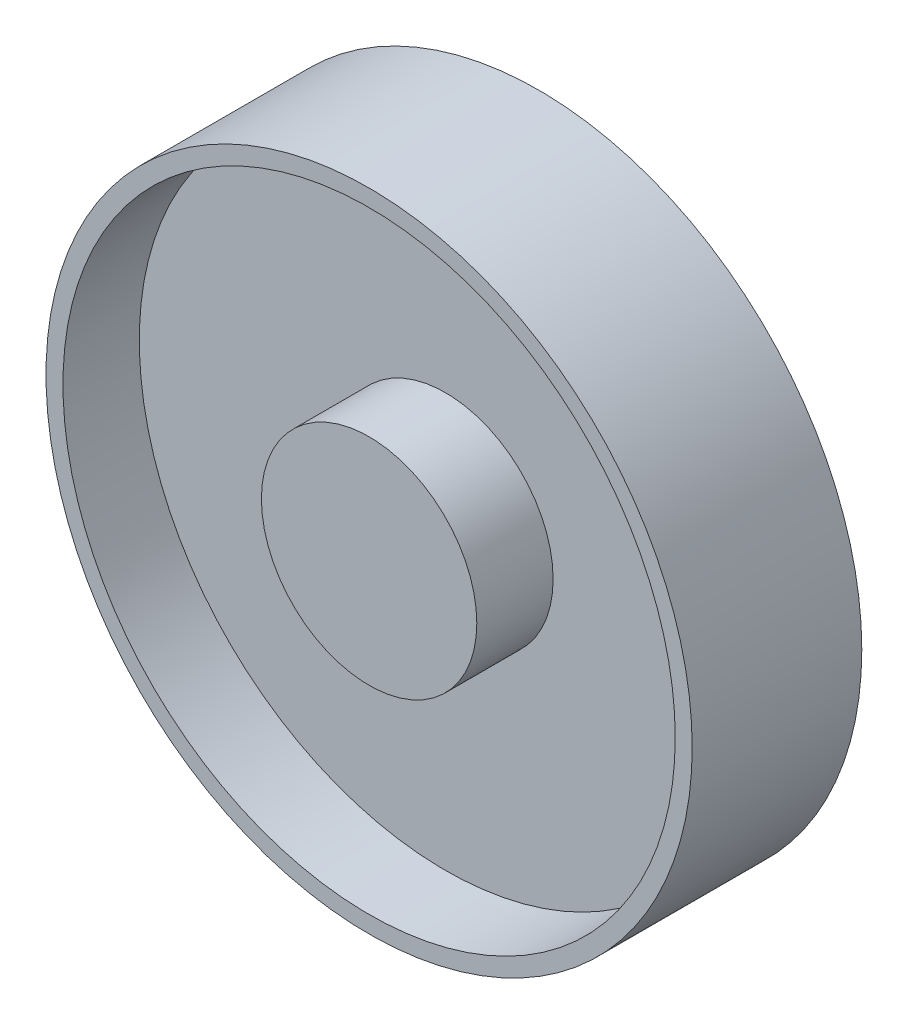
ISO-10303-21;
HEADER;
FILE_DESCRIPTION(('STEP AP214'),'2;1');
FILE_NAME('part.step','',(''),(''),'','','');
FILE_SCHEMA(('AUTOMOTIVE_DESIGN { 1 0 10303 214 1 1 1 1 }'));
ENDSEC;
DATA;
#1=APPLICATION_CONTEXT('core data for automotive mechanical design processes');
#2=APPLICATION_PROTOCOL_DEFINITION('international standard','automotive_design',2000,#1);
#3=PRODUCT_CONTEXT('',#1,'mechanical');
#4=PRODUCT('Part','Part','',(#3));
#5=PRODUCT_RELATED_PRODUCT_CATEGORY('part','',(#4));
#6=PRODUCT_DEFINITION_FORMATION('','',#4);
#7=PRODUCT_DEFINITION_CONTEXT('part definition',#1,'design');
#8=PRODUCT_DEFINITION('design','',#6,#7);
#9=PRODUCT_DEFINITION_SHAPE('','',#8);
#10=(LENGTH_UNIT() NAMED_UNIT(*) SI_UNIT(.MILLI.,.METRE.));
#11=(NAMED_UNIT(*) PLANE_ANGLE_UNIT() SI_UNIT($,.RADIAN.));
#12=(NAMED_UNIT(*) SI_UNIT($,.STERADIAN.) SOLID_ANGLE_UNIT());
#13=UNCERTAINTY_MEASURE_WITH_UNIT(LENGTH_MEASURE(1.E-05),#10,'distance_accuracy_value','');
#14=(GEOMETRIC_REPRESENTATION_CONTEXT(3) GLOBAL_UNCERTAINTY_ASSIGNED_CONTEXT((#13)) GLOBAL_UNIT_ASSIGNED_CONTEXT((#10,
#11,#12)) REPRESENTATION_CONTEXT('',''));
#15=CARTESIAN_POINT('',(0.,0.,0.));
#16=DIRECTION('',(0.,0.,1.));
#17=DIRECTION('',(1.,0.,0.));
#18=AXIS2_PLACEMENT_3D('',#15,#16,#17);
#19=CARTESIAN_POINT('',(0.,0.,0.5));
#20=DIRECTION('',(0.,0.,1.));
#21=DIRECTION('',(1.,0.,0.));
#22=AXIS2_PLACEMENT_3D('',#19,#20,#21);
#23=PLANE('',#22);
#24=CARTESIAN_POINT('',(0.,0.,0.5));
#25=DIRECTION('',(0.,0.,1.));
#26=DIRECTION('',(1.,0.,0.));
#27=AXIS2_PLACEMENT_3D('',#24,#25,#26);
#28=CIRCLE('',#27,6.35);
#29=CARTESIAN_POINT('',(6.35,0.,0.5));
#30=VERTEX_POINT('',#29);
#31=EDGE_CURVE('E11',#30,#30,#28,.T.);
#32=ORIENTED_EDGE('',*,*,#31,.F.);
#33=EDGE_LOOP('',(#32));
#34=FACE_BOUND('',#33,.T.);
#35=CARTESIAN_POINT('',(0.,0.,0.5));
#36=DIRECTION('',(0.,0.,1.));
#37=DIRECTION('',(1.,0.,0.));
#38=AXIS2_PLACEMENT_3D('',#35,#36,#37);
#39=CIRCLE('',#38,18.05);
#40=CARTESIAN_POINT('',(18.05,0.,0.5));
#41=VERTEX_POINT('',#40);
#42=EDGE_CURVE('E62',#41,#41,#39,.F.);
#43=ORIENTED_EDGE('',*,*,#42,.F.);
#44=EDGE_LOOP('',(#43));
#45=FACE_BOUND('',#44,.T.);
#46=ADVANCED_FACE('F43',(#34,#45),#23,.T.);
#47=CARTESIAN_POINT('',(0.,0.,5.));
#48=DIRECTION('',(0.,0.,-1.));
#49=DIRECTION('',(-1.,0.,0.));
#50=AXIS2_PLACEMENT_3D('',#47,#48,#49);
#51=CYLINDRICAL_SURFACE('',#50,6.35);
#52=ORIENTED_EDGE('',*,*,#31,.T.);
#53=EDGE_LOOP('',(#52));
#54=FACE_BOUND('',#53,.T.);
#55=CARTESIAN_POINT('',(0.,0.,5.));
#56=DIRECTION('',(0.,0.,1.));
#57=DIRECTION('',(1.,0.,0.));
#58=AXIS2_PLACEMENT_3D('',#55,#56,#57);
#59=CIRCLE('',#58,6.35);
#60=CARTESIAN_POINT('',(6.35,0.,5.));
#61=VERTEX_POINT('',#60);
#62=EDGE_CURVE('E58',#61,#61,#59,.T.);
#63=ORIENTED_EDGE('',*,*,#62,.F.);
#64=EDGE_LOOP('',(#63));
#65=FACE_BOUND('',#64,.T.);
#66=ADVANCED_FACE('F106',(#54,#65),#51,.T.);
#67=CARTESIAN_POINT('',(0.,0.,5.));
#68=DIRECTION('',(0.,0.,1.));
#69=DIRECTION('',(1.,0.,0.));
#70=AXIS2_PLACEMENT_3D('',#67,#68,#69);
#71=PLANE('',#70);
#72=ORIENTED_EDGE('',*,*,#62,.T.);
#73=EDGE_LOOP('',(#72));
#74=FACE_BOUND('',#73,.T.);
#75=ADVANCED_FACE('F111',(#74),#71,.T.);
#76=CARTESIAN_POINT('',(0.,0.,5.));
#77=DIRECTION('',(0.,0.,-1.));
#78=DIRECTION('',(-1.,0.,0.));
#79=AXIS2_PLACEMENT_3D('',#76,#77,#78);
#80=CYLINDRICAL_SURFACE('',#79,18.05);
#81=CARTESIAN_POINT('',(0.,0.,-5.));
#82=DIRECTION('',(0.,0.,1.));
#83=DIRECTION('',(1.,0.,0.));
#84=AXIS2_PLACEMENT_3D('',#81,#82,#83);
#85=CIRCLE('',#84,18.05);
#86=CARTESIAN_POINT('',(18.05,0.,-5.));
#87=VERTEX_POINT('',#86);
#88=EDGE_CURVE('E72',#87,#87,#85,.T.);
#89=ORIENTED_EDGE('',*,*,#88,.F.);
#90=EDGE_LOOP('',(#89));
#91=FACE_BOUND('',#90,.T.);
#92=CARTESIAN_POINT('',(0.,0.,-0.5));
#93=DIRECTION('',(0.,0.,1.));
#94=DIRECTION('',(1.,0.,0.));
#95=AXIS2_PLACEMENT_3D('',#92,#93,#94);
#96=CIRCLE('',#95,18.05);
#97=CARTESIAN_POINT('',(18.05,0.,-0.5));
#98=VERTEX_POINT('',#97);
#99=EDGE_CURVE('E47',#98,#98,#96,.T.);
#100=ORIENTED_EDGE('',*,*,#99,.T.);
#101=EDGE_LOOP('',(#100));
#102=FACE_BOUND('',#101,.T.);
#103=ADVANCED_FACE('F117',(#91,#102),#80,.F.);
#104=ORIENTED_EDGE('',*,*,#42,.T.);
#105=EDGE_LOOP('',(#104));
#106=FACE_BOUND('',#105,.T.);
#107=CARTESIAN_POINT('',(0.,0.,5.));
#108=DIRECTION('',(0.,0.,1.));
#109=DIRECTION('',(1.,0.,0.));
#110=AXIS2_PLACEMENT_3D('',#107,#108,#109);
#111=CIRCLE('',#110,18.05);
#112=CARTESIAN_POINT('',(18.05,0.,5.));
#113=VERTEX_POINT('',#112);
#114=EDGE_CURVE('E71',#113,#113,#111,.T.);
#115=ORIENTED_EDGE('',*,*,#114,.T.);
#116=EDGE_LOOP('',(#115));
#117=FACE_BOUND('',#116,.T.);
#118=ADVANCED_FACE('F80',(#106,#117),#80,.F.);
#119=CARTESIAN_POINT('',(0.,0.,5.));
#120=DIRECTION('',(0.,0.,-1.));
#121=DIRECTION('',(-1.,0.,0.));
#122=AXIS2_PLACEMENT_3D('',#119,#120,#121);
#123=CYLINDRICAL_SURFACE('',#122,19.05);
#124=CARTESIAN_POINT('',(0.,0.,5.));
#125=DIRECTION('',(0.,0.,1.));
#126=DIRECTION('',(1.,0.,0.));
#127=AXIS2_PLACEMENT_3D('',#124,#125,#126);
#128=CIRCLE('',#127,19.05);
#129=CARTESIAN_POINT('',(19.05,0.,5.));
#130=VERTEX_POINT('',#129);
#131=EDGE_CURVE('E67',#130,#130,#128,.T.);
#132=ORIENTED_EDGE('',*,*,#131,.F.);
#133=EDGE_LOOP('',(#132));
#134=FACE_BOUND('',#133,.T.);
#135=CARTESIAN_POINT('',(0.,0.,-5.));
#136=DIRECTION('',(0.,0.,1.));
#137=DIRECTION('',(1.,0.,0.));
#138=AXIS2_PLACEMENT_3D('',#135,#136,#137);
#139=CIRCLE('',#138,19.05);
#140=CARTESIAN_POINT('',(19.05,0.,-5.));
#141=VERTEX_POINT('',#140);
#142=EDGE_CURVE('E68',#141,#141,#139,.T.);
#143=ORIENTED_EDGE('',*,*,#142,.T.);
#144=EDGE_LOOP('',(#143));
#145=FACE_BOUND('',#144,.T.);
#146=ADVANCED_FACE('F86',(#134,#145),#123,.T.);
#147=CARTESIAN_POINT('',(0.,0.,5.));
#148=DIRECTION('',(0.,0.,1.));
#149=DIRECTION('',(1.,0.,0.));
#150=AXIS2_PLACEMENT_3D('',#147,#148,#149);
#151=PLANE('',#150);
#152=ORIENTED_EDGE('',*,*,#114,.F.);
#153=EDGE_LOOP('',(#152));
#154=FACE_BOUND('',#153,.T.);
#155=ORIENTED_EDGE('',*,*,#131,.T.);
#156=EDGE_LOOP('',(#155));
#157=FACE_BOUND('',#156,.T.);
#158=ADVANCED_FACE('F82',(#154,#157),#151,.T.);
#159=CARTESIAN_POINT('',(0.,0.,-5.));
#160=DIRECTION('',(0.,0.,1.));
#161=DIRECTION('',(1.,0.,0.));
#162=AXIS2_PLACEMENT_3D('',#159,#160,#161);
#163=PLANE('',#162);
#164=ORIENTED_EDGE('',*,*,#88,.T.);
#165=EDGE_LOOP('',(#164));
#166=FACE_BOUND('',#165,.T.);
#167=ORIENTED_EDGE('',*,*,#142,.F.);
#168=EDGE_LOOP('',(#167));
#169=FACE_BOUND('',#168,.T.);
#170=ADVANCED_FACE('F85',(#166,#169),#163,.F.);
#171=CARTESIAN_POINT('',(0.,0.,-5.));
#172=DIRECTION('',(0.,0.,1.));
#173=DIRECTION('',(1.,0.,0.));
#174=AXIS2_PLACEMENT_3D('',#171,#172,#173);
#175=PLANE('',#174);
#176=CARTESIAN_POINT('',(0.,0.,-5.));
#177=DIRECTION('',(0.,0.,1.));
#178=DIRECTION('',(1.,0.,0.));
#179=AXIS2_PLACEMENT_3D('',#176,#177,#178);
#180=CIRCLE('',#179,6.35);
#181=CARTESIAN_POINT('',(6.35,0.,-5.));
#182=VERTEX_POINT('',#181);
#183=EDGE_CURVE('E59',#182,#182,#180,.T.);
#184=ORIENTED_EDGE('',*,*,#183,.F.);
#185=EDGE_LOOP('',(#184));
#186=FACE_BOUND('',#185,.T.);
#187=ADVANCED_FACE('F96',(#186),#175,.F.);
#188=ORIENTED_EDGE('',*,*,#183,.T.);
#189=EDGE_LOOP('',(#188));
#190=FACE_BOUND('',#189,.T.);
#191=CARTESIAN_POINT('',(0.,0.,-0.5));
#192=DIRECTION('',(0.,0.,1.));
#193=DIRECTION('',(1.,0.,0.));
#194=AXIS2_PLACEMENT_3D('',#191,#192,#193);
#195=CIRCLE('',#194,6.35);
#196=CARTESIAN_POINT('',(6.35,0.,-0.5));
#197=VERTEX_POINT('',#196);
#198=EDGE_CURVE('E54',#197,#197,#195,.F.);
#199=ORIENTED_EDGE('',*,*,#198,.T.);
#200=EDGE_LOOP('',(#199));
#201=FACE_BOUND('',#200,.T.);
#202=ADVANCED_FACE('F102',(#190,#201),#51,.T.);
#203=CARTESIAN_POINT('',(0.,0.,-0.5));
#204=DIRECTION('',(0.,0.,1.));
#205=DIRECTION('',(1.,0.,0.));
#206=AXIS2_PLACEMENT_3D('',#203,#204,#205);
#207=PLANE('',#206);
#208=ORIENTED_EDGE('',*,*,#198,.F.);
#209=EDGE_LOOP('',(#208));
#210=FACE_BOUND('',#209,.T.);
#211=ORIENTED_EDGE('',*,*,#99,.F.);
#212=EDGE_LOOP('',(#211));
#213=FACE_BOUND('',#212,.T.);
#214=ADVANCED_FACE('F45',(#210,#213),#207,.F.);
#215=CLOSED_SHELL('',(#46,#66,#75,#103,#118,#146,#158,#170,#187,#202,#214));
#216=MANIFOLD_SOLID_BREP('B2',#215);
#217=ADVANCED_BREP_SHAPE_REPRESENTATION('',(#18,#216),#14);
#218=SHAPE_DEFINITION_REPRESENTATION(#9,#217);
ENDSEC;
END-ISO-10303-21;
